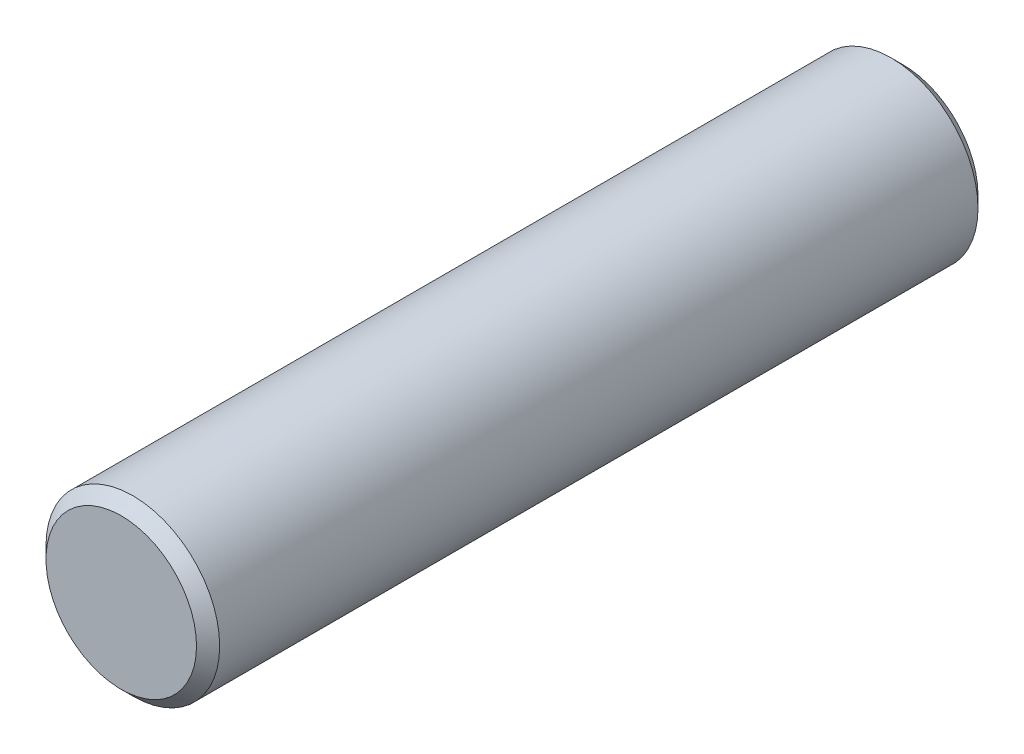
ISO-10303-21;
HEADER;
FILE_DESCRIPTION(('STEP AP214'),'2;1');
FILE_NAME('part.step','',(''),(''),'','','');
FILE_SCHEMA(('AUTOMOTIVE_DESIGN { 1 0 10303 214 1 1 1 1 }'));
ENDSEC;
DATA;
#1=APPLICATION_CONTEXT('core data for automotive mechanical design processes');
#2=APPLICATION_PROTOCOL_DEFINITION('international standard','automotive_design',2000,#1);
#3=PRODUCT_CONTEXT('',#1,'mechanical');
#4=PRODUCT('Part','Part','',(#3));
#5=PRODUCT_RELATED_PRODUCT_CATEGORY('part','',(#4));
#6=PRODUCT_DEFINITION_FORMATION('','',#4);
#7=PRODUCT_DEFINITION_CONTEXT('part definition',#1,'design');
#8=PRODUCT_DEFINITION('design','',#6,#7);
#9=PRODUCT_DEFINITION_SHAPE('','',#8);
#10=(LENGTH_UNIT() NAMED_UNIT(*) SI_UNIT(.MILLI.,.METRE.));
#11=(NAMED_UNIT(*) PLANE_ANGLE_UNIT() SI_UNIT($,.RADIAN.));
#12=(NAMED_UNIT(*) SI_UNIT($,.STERADIAN.) SOLID_ANGLE_UNIT());
#13=UNCERTAINTY_MEASURE_WITH_UNIT(LENGTH_MEASURE(1.E-05),#10,'distance_accuracy_value','');
#14=(GEOMETRIC_REPRESENTATION_CONTEXT(3) GLOBAL_UNCERTAINTY_ASSIGNED_CONTEXT((#13)) GLOBAL_UNIT_ASSIGNED_CONTEXT((#10,
#11,#12)) REPRESENTATION_CONTEXT('',''));
#15=CARTESIAN_POINT('',(0.,0.,0.));
#16=DIRECTION('',(0.,0.,1.));
#17=DIRECTION('',(1.,0.,0.));
#18=AXIS2_PLACEMENT_3D('',#15,#16,#17);
#19=CARTESIAN_POINT('',(0.,0.,13.5));
#20=DIRECTION('',(0.,0.,-1.));
#21=DIRECTION('',(-1.,0.,0.));
#22=AXIS2_PLACEMENT_3D('',#19,#20,#21);
#23=CYLINDRICAL_SURFACE('',#22,1.5);
#24=CARTESIAN_POINT('',(0.,0.,0.200000000000002));
#25=DIRECTION('',(0.,0.,1.));
#26=DIRECTION('',(1.,0.,0.));
#27=AXIS2_PLACEMENT_3D('',#24,#25,#26);
#28=CIRCLE('',#27,1.5);
#29=CARTESIAN_POINT('',(1.5,0.,0.200000000000002));
#30=VERTEX_POINT('',#29);
#31=EDGE_CURVE('E60',#30,#30,#28,.T.);
#32=ORIENTED_EDGE('',*,*,#31,.T.);
#33=EDGE_LOOP('',(#32));
#34=FACE_BOUND('',#33,.T.);
#35=CARTESIAN_POINT('',(0.,0.,13.3));
#36=DIRECTION('',(0.,0.,1.));
#37=DIRECTION('',(1.,0.,0.));
#38=AXIS2_PLACEMENT_3D('',#35,#36,#37);
#39=CIRCLE('',#38,1.5);
#40=CARTESIAN_POINT('',(1.5,0.,13.3));
#41=VERTEX_POINT('',#40);
#42=EDGE_CURVE('E65',#41,#41,#39,.F.);
#43=ORIENTED_EDGE('',*,*,#42,.T.);
#44=EDGE_LOOP('',(#43));
#45=FACE_BOUND('',#44,.T.);
#46=ADVANCED_FACE('F51',(#34,#45),#23,.T.);
#47=CARTESIAN_POINT('',(0.,0.,13.5));
#48=DIRECTION('',(0.,0.,1.));
#49=DIRECTION('',(1.,0.,0.));
#50=AXIS2_PLACEMENT_3D('',#47,#48,#49);
#51=PLANE('',#50);
#52=CARTESIAN_POINT('',(0.,0.,13.5));
#53=DIRECTION('',(0.,0.,1.));
#54=DIRECTION('',(1.,0.,0.));
#55=AXIS2_PLACEMENT_3D('',#52,#53,#54);
#56=CIRCLE('',#55,1.3);
#57=CARTESIAN_POINT('',(1.3,0.,13.5));
#58=VERTEX_POINT('',#57);
#59=EDGE_CURVE('E70',#58,#58,#56,.T.);
#60=ORIENTED_EDGE('',*,*,#59,.T.);
#61=EDGE_LOOP('',(#60));
#62=FACE_BOUND('',#61,.T.);
#63=ADVANCED_FACE('F77',(#62),#51,.T.);
#64=CARTESIAN_POINT('',(0.,0.,0.));
#65=DIRECTION('',(0.,0.,1.));
#66=DIRECTION('',(1.,0.,0.));
#67=AXIS2_PLACEMENT_3D('',#64,#65,#66);
#68=PLANE('',#67);
#69=CARTESIAN_POINT('',(0.,0.,0.));
#70=DIRECTION('',(0.,0.,1.));
#71=DIRECTION('',(1.,0.,0.));
#72=AXIS2_PLACEMENT_3D('',#69,#70,#71);
#73=CIRCLE('',#72,1.3);
#74=CARTESIAN_POINT('',(1.3,0.,0.));
#75=VERTEX_POINT('',#74);
#76=EDGE_CURVE('E10',#75,#75,#73,.F.);
#77=ORIENTED_EDGE('',*,*,#76,.T.);
#78=EDGE_LOOP('',(#77));
#79=FACE_BOUND('',#78,.T.);
#80=ADVANCED_FACE('F81',(#79),#68,.F.);
#81=CARTESIAN_POINT('',(0.,0.,13.5));
#82=DIRECTION('',(0.,0.,-1.));
#83=DIRECTION('',(-1.,0.,0.));
#84=AXIS2_PLACEMENT_3D('',#81,#82,#83);
#85=CONICAL_SURFACE('',#84,1.3,0.785398163397449);
#86=ORIENTED_EDGE('',*,*,#42,.F.);
#87=EDGE_LOOP('',(#86));
#88=FACE_BOUND('',#87,.T.);
#89=ORIENTED_EDGE('',*,*,#59,.F.);
#90=EDGE_LOOP('',(#89));
#91=FACE_BOUND('',#90,.T.);
#92=ADVANCED_FACE('F79',(#88,#91),#85,.T.);
#93=CARTESIAN_POINT('',(0.,0.,0.200000000000002));
#94=DIRECTION('',(0.,0.,1.));
#95=DIRECTION('',(1.,0.,0.));
#96=AXIS2_PLACEMENT_3D('',#93,#94,#95);
#97=CONICAL_SURFACE('',#96,1.5,0.785398163397449);
#98=ORIENTED_EDGE('',*,*,#76,.F.);
#99=EDGE_LOOP('',(#98));
#100=FACE_BOUND('',#99,.T.);
#101=ORIENTED_EDGE('',*,*,#31,.F.);
#102=EDGE_LOOP('',(#101));
#103=FACE_BOUND('',#102,.T.);
#104=ADVANCED_FACE('F54',(#100,#103),#97,.T.);
#105=CLOSED_SHELL('',(#46,#63,#80,#92,#104));
#106=MANIFOLD_SOLID_BREP('B2',#105);
#107=ADVANCED_BREP_SHAPE_REPRESENTATION('',(#18,#106),#14);
#108=SHAPE_DEFINITION_REPRESENTATION(#9,#107);
ENDSEC;
END-ISO-10303-21;
